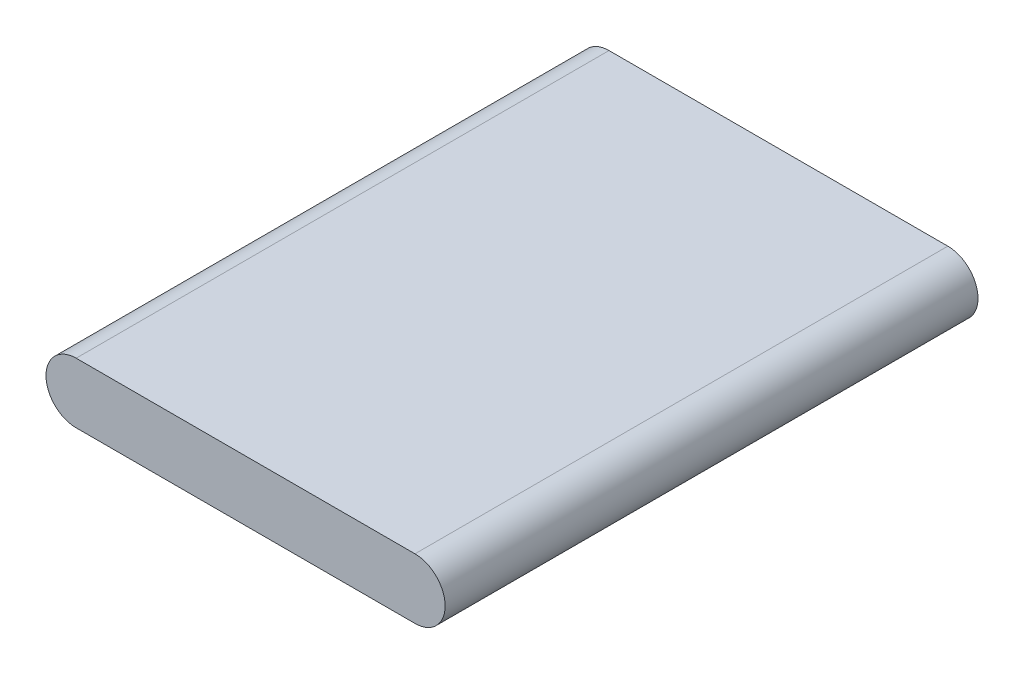
ISO-10303-21;
HEADER;
FILE_DESCRIPTION(('STEP AP214'),'2;1');
FILE_NAME('part.step','',(''),(''),'','','');
FILE_SCHEMA(('AUTOMOTIVE_DESIGN { 1 0 10303 214 1 1 1 1 }'));
ENDSEC;
DATA;
#1=APPLICATION_CONTEXT('core data for automotive mechanical design processes');
#2=APPLICATION_PROTOCOL_DEFINITION('international standard','automotive_design',2000,#1);
#3=PRODUCT_CONTEXT('',#1,'mechanical');
#4=PRODUCT('Part','Part','',(#3));
#5=PRODUCT_RELATED_PRODUCT_CATEGORY('part','',(#4));
#6=PRODUCT_DEFINITION_FORMATION('','',#4);
#7=PRODUCT_DEFINITION_CONTEXT('part definition',#1,'design');
#8=PRODUCT_DEFINITION('design','',#6,#7);
#9=PRODUCT_DEFINITION_SHAPE('','',#8);
#10=(LENGTH_UNIT() NAMED_UNIT(*) SI_UNIT(.MILLI.,.METRE.));
#11=(NAMED_UNIT(*) PLANE_ANGLE_UNIT() SI_UNIT($,.RADIAN.));
#12=(NAMED_UNIT(*) SI_UNIT($,.STERADIAN.) SOLID_ANGLE_UNIT());
#13=UNCERTAINTY_MEASURE_WITH_UNIT(LENGTH_MEASURE(1.E-05),#10,'distance_accuracy_value','');
#14=(GEOMETRIC_REPRESENTATION_CONTEXT(3) GLOBAL_UNCERTAINTY_ASSIGNED_CONTEXT((#13)) GLOBAL_UNIT_ASSIGNED_CONTEXT((#10,
#11,#12)) REPRESENTATION_CONTEXT('',''));
#15=CARTESIAN_POINT('',(0.,0.,0.));
#16=DIRECTION('',(0.,0.,1.));
#17=DIRECTION('',(1.,0.,0.));
#18=AXIS2_PLACEMENT_3D('',#15,#16,#17);
#19=CARTESIAN_POINT('',(-16.85,0.,53.));
#20=DIRECTION('',(0.,0.,-1.));
#21=DIRECTION('',(-1.,0.,0.));
#22=AXIS2_PLACEMENT_3D('',#19,#20,#21);
#23=CYLINDRICAL_SURFACE('',#22,3.00000000000001);
#24=CARTESIAN_POINT('',(-16.85,0.,0.));
#25=DIRECTION('',(0.,0.,1.));
#26=DIRECTION('',(1.,0.,0.));
#27=AXIS2_PLACEMENT_3D('',#24,#25,#26);
#28=CIRCLE('',#27,3.00000000000001);
#29=CARTESIAN_POINT('',(-16.85,3.00000000000001,0.));
#30=VERTEX_POINT('',#29);
#31=CARTESIAN_POINT('',(-16.85,-3.00000000000001,0.));
#32=VERTEX_POINT('',#31);
#33=EDGE_CURVE('E98',#30,#32,#28,.T.);
#34=ORIENTED_EDGE('',*,*,#33,.T.);
#35=DIRECTION('',(0.,0.,-1.));
#36=VECTOR('',#35,1.);
#37=CARTESIAN_POINT('',(-16.85,-3.00000000000001,53.));
#38=LINE('',#37,#36);
#39=CARTESIAN_POINT('',(-16.85,-3.00000000000001,53.));
#40=VERTEX_POINT('',#39);
#41=EDGE_CURVE('E11',#40,#32,#38,.T.);
#42=ORIENTED_EDGE('',*,*,#41,.F.);
#43=CARTESIAN_POINT('',(-16.85,0.,53.));
#44=DIRECTION('',(0.,0.,1.));
#45=DIRECTION('',(1.,0.,0.));
#46=AXIS2_PLACEMENT_3D('',#43,#44,#45);
#47=CIRCLE('',#46,3.00000000000001);
#48=CARTESIAN_POINT('',(-16.85,3.00000000000001,53.));
#49=VERTEX_POINT('',#48);
#50=EDGE_CURVE('E86',#49,#40,#47,.T.);
#51=ORIENTED_EDGE('',*,*,#50,.F.);
#52=DIRECTION('',(0.,0.,-1.));
#53=VECTOR('',#52,1.);
#54=CARTESIAN_POINT('',(-16.85,3.00000000000001,53.));
#55=LINE('',#54,#53);
#56=EDGE_CURVE('E94',#49,#30,#55,.T.);
#57=ORIENTED_EDGE('',*,*,#56,.T.);
#58=EDGE_LOOP('',(#34,#42,#51,#57));
#59=FACE_BOUND('',#58,.T.);
#60=ADVANCED_FACE('F35',(#59),#23,.T.);
#61=CARTESIAN_POINT('',(-16.85,-3.00000000000001,53.));
#62=DIRECTION('',(0.,1.,0.));
#63=DIRECTION('',(-1.,0.,0.));
#64=AXIS2_PLACEMENT_3D('',#61,#62,#63);
#65=PLANE('',#64);
#66=DIRECTION('',(1.,0.,0.));
#67=VECTOR('',#66,1.);
#68=CARTESIAN_POINT('',(-16.85,-3.00000000000001,0.));
#69=LINE('',#68,#67);
#70=CARTESIAN_POINT('',(16.85,-3.,0.));
#71=VERTEX_POINT('',#70);
#72=EDGE_CURVE('E90',#32,#71,#69,.T.);
#73=ORIENTED_EDGE('',*,*,#72,.T.);
#74=DIRECTION('',(0.,0.,-1.));
#75=VECTOR('',#74,1.);
#76=CARTESIAN_POINT('',(16.85,-3.,53.));
#77=LINE('',#76,#75);
#78=CARTESIAN_POINT('',(16.85,-3.,53.));
#79=VERTEX_POINT('',#78);
#80=EDGE_CURVE('E43',#79,#71,#77,.T.);
#81=ORIENTED_EDGE('',*,*,#80,.F.);
#82=DIRECTION('',(1.,0.,0.));
#83=VECTOR('',#82,1.);
#84=CARTESIAN_POINT('',(-16.85,-3.00000000000001,53.));
#85=LINE('',#84,#83);
#86=EDGE_CURVE('E81',#40,#79,#85,.T.);
#87=ORIENTED_EDGE('',*,*,#86,.F.);
#88=ORIENTED_EDGE('',*,*,#41,.T.);
#89=EDGE_LOOP('',(#73,#81,#87,#88));
#90=FACE_BOUND('',#89,.T.);
#91=ADVANCED_FACE('F89',(#90),#65,.F.);
#92=CARTESIAN_POINT('',(16.85,0.,53.));
#93=DIRECTION('',(0.,0.,-1.));
#94=DIRECTION('',(-1.,0.,0.));
#95=AXIS2_PLACEMENT_3D('',#92,#93,#94);
#96=CYLINDRICAL_SURFACE('',#95,3.00000000000001);
#97=CARTESIAN_POINT('',(16.85,0.,0.));
#98=DIRECTION('',(0.,0.,1.));
#99=DIRECTION('',(1.,0.,0.));
#100=AXIS2_PLACEMENT_3D('',#97,#98,#99);
#101=CIRCLE('',#100,3.00000000000001);
#102=CARTESIAN_POINT('',(16.85,3.00000000000001,0.));
#103=VERTEX_POINT('',#102);
#104=EDGE_CURVE('E68',#71,#103,#101,.T.);
#105=ORIENTED_EDGE('',*,*,#104,.T.);
#106=DIRECTION('',(0.,0.,-1.));
#107=VECTOR('',#106,1.);
#108=CARTESIAN_POINT('',(16.85,3.00000000000001,53.));
#109=LINE('',#108,#107);
#110=CARTESIAN_POINT('',(16.85,3.00000000000001,53.));
#111=VERTEX_POINT('',#110);
#112=EDGE_CURVE('E91',#111,#103,#109,.T.);
#113=ORIENTED_EDGE('',*,*,#112,.F.);
#114=CARTESIAN_POINT('',(16.85,0.,53.));
#115=DIRECTION('',(0.,0.,1.));
#116=DIRECTION('',(1.,0.,0.));
#117=AXIS2_PLACEMENT_3D('',#114,#115,#116);
#118=CIRCLE('',#117,3.00000000000001);
#119=EDGE_CURVE('E84',#79,#111,#118,.T.);
#120=ORIENTED_EDGE('',*,*,#119,.F.);
#121=ORIENTED_EDGE('',*,*,#80,.T.);
#122=EDGE_LOOP('',(#105,#113,#120,#121));
#123=FACE_BOUND('',#122,.T.);
#124=ADVANCED_FACE('F92',(#123),#96,.T.);
#125=CARTESIAN_POINT('',(-16.85,3.00000000000001,53.));
#126=DIRECTION('',(0.,-1.,0.));
#127=DIRECTION('',(1.,0.,0.));
#128=AXIS2_PLACEMENT_3D('',#125,#126,#127);
#129=PLANE('',#128);
#130=DIRECTION('',(-1.,0.,0.));
#131=VECTOR('',#130,1.);
#132=CARTESIAN_POINT('',(-16.85,3.00000000000001,0.));
#133=LINE('',#132,#131);
#134=EDGE_CURVE('E74',#103,#30,#133,.T.);
#135=ORIENTED_EDGE('',*,*,#134,.T.);
#136=ORIENTED_EDGE('',*,*,#56,.F.);
#137=DIRECTION('',(-1.,0.,0.));
#138=VECTOR('',#137,1.);
#139=CARTESIAN_POINT('',(-16.85,3.00000000000001,53.));
#140=LINE('',#139,#138);
#141=EDGE_CURVE('E51',#111,#49,#140,.T.);
#142=ORIENTED_EDGE('',*,*,#141,.F.);
#143=ORIENTED_EDGE('',*,*,#112,.T.);
#144=EDGE_LOOP('',(#135,#136,#142,#143));
#145=FACE_BOUND('',#144,.T.);
#146=ADVANCED_FACE('F105',(#145),#129,.F.);
#147=CARTESIAN_POINT('',(-16.85,0.,53.));
#148=DIRECTION('',(0.,0.,1.));
#149=DIRECTION('',(1.,0.,0.));
#150=AXIS2_PLACEMENT_3D('',#147,#148,#149);
#151=PLANE('',#150);
#152=ORIENTED_EDGE('',*,*,#50,.T.);
#153=ORIENTED_EDGE('',*,*,#86,.T.);
#154=ORIENTED_EDGE('',*,*,#119,.T.);
#155=ORIENTED_EDGE('',*,*,#141,.T.);
#156=EDGE_LOOP('',(#152,#153,#154,#155));
#157=FACE_BOUND('',#156,.T.);
#158=ADVANCED_FACE('F82',(#157),#151,.T.);
#159=CARTESIAN_POINT('',(-16.85,0.,0.));
#160=DIRECTION('',(0.,0.,1.));
#161=DIRECTION('',(1.,0.,0.));
#162=AXIS2_PLACEMENT_3D('',#159,#160,#161);
#163=PLANE('',#162);
#164=ORIENTED_EDGE('',*,*,#33,.F.);
#165=ORIENTED_EDGE('',*,*,#134,.F.);
#166=ORIENTED_EDGE('',*,*,#104,.F.);
#167=ORIENTED_EDGE('',*,*,#72,.F.);
#168=EDGE_LOOP('',(#164,#165,#166,#167));
#169=FACE_BOUND('',#168,.T.);
#170=ADVANCED_FACE('F108',(#169),#163,.F.);
#171=CLOSED_SHELL('',(#60,#91,#124,#146,#158,#170));
#172=MANIFOLD_SOLID_BREP('B2',#171);
#173=ADVANCED_BREP_SHAPE_REPRESENTATION('',(#18,#172),#14);
#174=SHAPE_DEFINITION_REPRESENTATION(#9,#173);
ENDSEC;
END-ISO-10303-21;
